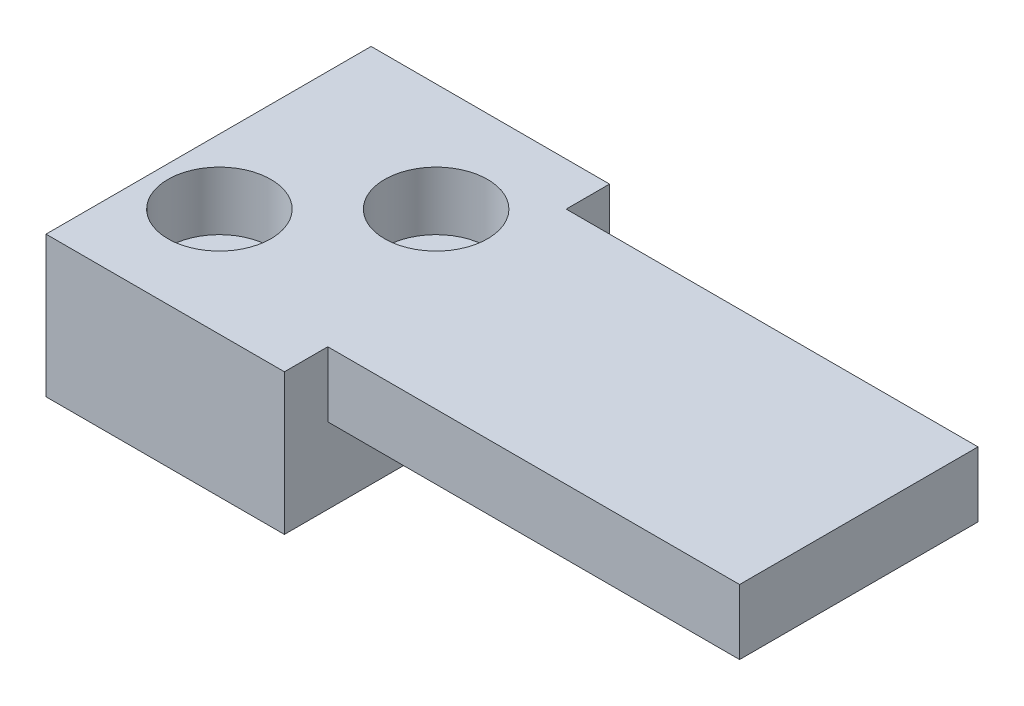
ISO-10303-21;
HEADER;
FILE_DESCRIPTION(('STEP AP214'),'2;1');
FILE_NAME('part.step','',(''),(''),'','','');
FILE_SCHEMA(('AUTOMOTIVE_DESIGN { 1 0 10303 214 1 1 1 1 }'));
ENDSEC;
DATA;
#1=APPLICATION_CONTEXT('core data for automotive mechanical design processes');
#2=APPLICATION_PROTOCOL_DEFINITION('international standard','automotive_design',2000,#1);
#3=PRODUCT_CONTEXT('',#1,'mechanical');
#4=PRODUCT('Part','Part','',(#3));
#5=PRODUCT_RELATED_PRODUCT_CATEGORY('part','',(#4));
#6=PRODUCT_DEFINITION_FORMATION('','',#4);
#7=PRODUCT_DEFINITION_CONTEXT('part definition',#1,'design');
#8=PRODUCT_DEFINITION('design','',#6,#7);
#9=PRODUCT_DEFINITION_SHAPE('','',#8);
#10=(LENGTH_UNIT() NAMED_UNIT(*) SI_UNIT(.MILLI.,.METRE.));
#11=(NAMED_UNIT(*) PLANE_ANGLE_UNIT() SI_UNIT($,.RADIAN.));
#12=(NAMED_UNIT(*) SI_UNIT($,.STERADIAN.) SOLID_ANGLE_UNIT());
#13=UNCERTAINTY_MEASURE_WITH_UNIT(LENGTH_MEASURE(1.E-05),#10,'distance_accuracy_value','');
#14=(GEOMETRIC_REPRESENTATION_CONTEXT(3) GLOBAL_UNCERTAINTY_ASSIGNED_CONTEXT((#13)) GLOBAL_UNIT_ASSIGNED_CONTEXT((#10,
#11,#12)) REPRESENTATION_CONTEXT('',''));
#15=CARTESIAN_POINT('',(0.,0.,0.));
#16=DIRECTION('',(0.,0.,1.));
#17=DIRECTION('',(1.,0.,0.));
#18=AXIS2_PLACEMENT_3D('',#15,#16,#17);
#19=CARTESIAN_POINT('',(16.,-13.,10.));
#20=DIRECTION('',(0.,1.,0.));
#21=DIRECTION('',(0.,0.,1.));
#22=AXIS2_PLACEMENT_3D('',#19,#20,#21);
#23=CYLINDRICAL_SURFACE('',#22,2.75);
#24=CARTESIAN_POINT('',(16.,-13.,10.));
#25=DIRECTION('',(0.,1.,0.));
#26=DIRECTION('',(0.,0.,1.));
#27=AXIS2_PLACEMENT_3D('',#24,#25,#26);
#28=CIRCLE('',#27,2.75);
#29=CARTESIAN_POINT('',(16.,-13.,12.75));
#30=VERTEX_POINT('',#29);
#31=EDGE_CURVE('E187',#30,#30,#28,.T.);
#32=CARTESIAN_POINT('',(16.,-5.4,10.));
#33=DIRECTION('',(0.,1.,0.));
#34=DIRECTION('',(0.,0.,1.));
#35=AXIS2_PLACEMENT_3D('',#32,#33,#34);
#36=CIRCLE('',#35,2.75);
#37=CARTESIAN_POINT('',(16.,-5.4,12.75));
#38=VERTEX_POINT('',#37);
#39=EDGE_CURVE('E65',#38,#38,#36,.F.);
#40=CARTESIAN_POINT('',(16.,-13.,12.75));
#41=CARTESIAN_POINT('',(16.,-12.9208333333333,12.75));
#42=CARTESIAN_POINT('',(16.,-12.8416666666667,12.75));
#43=CARTESIAN_POINT('',(16.,-12.6833333333333,12.75));
#44=CARTESIAN_POINT('',(16.,-12.6041666666667,12.75));
#45=CARTESIAN_POINT('',(16.,-12.4458333333333,12.75));
#46=CARTESIAN_POINT('',(16.,-12.3666666666667,12.75));
#47=CARTESIAN_POINT('',(16.,-12.2083333333333,12.75));
#48=CARTESIAN_POINT('',(16.,-12.1291666666667,12.75));
#49=CARTESIAN_POINT('',(16.,-11.9708333333333,12.75));
#50=CARTESIAN_POINT('',(16.,-11.8916666666667,12.75));
#51=CARTESIAN_POINT('',(16.,-11.7333333333333,12.75));
#52=CARTESIAN_POINT('',(16.,-11.6541666666667,12.75));
#53=CARTESIAN_POINT('',(16.,-11.4958333333333,12.75));
#54=CARTESIAN_POINT('',(16.,-11.4166666666667,12.75));
#55=CARTESIAN_POINT('',(16.,-11.2583333333333,12.75));
#56=CARTESIAN_POINT('',(16.,-11.1791666666667,12.75));
#57=CARTESIAN_POINT('',(16.,-11.0208333333333,12.75));
#58=CARTESIAN_POINT('',(16.,-10.9416666666667,12.75));
#59=CARTESIAN_POINT('',(16.,-10.7833333333333,12.75));
#60=CARTESIAN_POINT('',(16.,-10.7041666666667,12.75));
#61=CARTESIAN_POINT('',(16.,-10.5458333333333,12.75));
#62=CARTESIAN_POINT('',(16.,-10.4666666666667,12.75));
#63=CARTESIAN_POINT('',(16.,-10.3083333333333,12.75));
#64=CARTESIAN_POINT('',(16.,-10.2291666666667,12.75));
#65=CARTESIAN_POINT('',(16.,-10.0708333333333,12.75));
#66=CARTESIAN_POINT('',(16.,-9.99166666666667,12.75));
#67=CARTESIAN_POINT('',(16.,-9.83333333333333,12.75));
#68=CARTESIAN_POINT('',(16.,-9.75416666666667,12.75));
#69=CARTESIAN_POINT('',(16.,-9.59583333333333,12.75));
#70=CARTESIAN_POINT('',(16.,-9.51666666666667,12.75));
#71=CARTESIAN_POINT('',(16.,-9.35833333333333,12.75));
#72=CARTESIAN_POINT('',(16.,-9.27916666666667,12.75));
#73=CARTESIAN_POINT('',(16.,-9.12083333333334,12.75));
#74=CARTESIAN_POINT('',(16.,-9.04166666666667,12.75));
#75=CARTESIAN_POINT('',(16.,-8.88333333333333,12.75));
#76=CARTESIAN_POINT('',(16.,-8.80416666666667,12.75));
#77=CARTESIAN_POINT('',(16.,-8.64583333333334,12.75));
#78=CARTESIAN_POINT('',(16.,-8.56666666666667,12.75));
#79=CARTESIAN_POINT('',(16.,-8.40833333333333,12.75));
#80=CARTESIAN_POINT('',(16.,-8.32916666666667,12.75));
#81=CARTESIAN_POINT('',(16.,-8.17083333333334,12.75));
#82=CARTESIAN_POINT('',(16.,-8.09166666666667,12.75));
#83=CARTESIAN_POINT('',(16.,-7.93333333333334,12.75));
#84=CARTESIAN_POINT('',(16.,-7.85416666666667,12.75));
#85=CARTESIAN_POINT('',(16.,-7.69583333333334,12.75));
#86=CARTESIAN_POINT('',(16.,-7.61666666666667,12.75));
#87=CARTESIAN_POINT('',(16.,-7.45833333333334,12.75));
#88=CARTESIAN_POINT('',(16.,-7.37916666666667,12.75));
#89=CARTESIAN_POINT('',(16.,-7.22083333333334,12.75));
#90=CARTESIAN_POINT('',(16.,-7.14166666666667,12.75));
#91=CARTESIAN_POINT('',(16.,-6.98333333333334,12.75));
#92=CARTESIAN_POINT('',(16.,-6.90416666666667,12.75));
#93=CARTESIAN_POINT('',(16.,-6.74583333333334,12.75));
#94=CARTESIAN_POINT('',(16.,-6.66666666666667,12.75));
#95=CARTESIAN_POINT('',(16.,-6.50833333333334,12.75));
#96=CARTESIAN_POINT('',(16.,-6.42916666666667,12.75));
#97=CARTESIAN_POINT('',(16.,-6.27083333333334,12.75));
#98=CARTESIAN_POINT('',(16.,-6.19166666666667,12.75));
#99=CARTESIAN_POINT('',(16.,-6.03333333333334,12.75));
#100=CARTESIAN_POINT('',(16.,-5.95416666666667,12.75));
#101=CARTESIAN_POINT('',(16.,-5.79583333333334,12.75));
#102=CARTESIAN_POINT('',(16.,-5.71666666666667,12.75));
#103=CARTESIAN_POINT('',(16.,-5.55833333333334,12.75));
#104=CARTESIAN_POINT('',(16.,-5.47916666666667,12.75));
#105=CARTESIAN_POINT('',(16.,-5.4,12.75));
#106=B_SPLINE_CURVE_WITH_KNOTS('',3,(#40,#41,#42,#43,#44,#45,#46,#47,#48,#49,#50,#51,#52,#53,
#54,#55,#56,#57,#58,#59,#60,#61,#62,#63,#64,#65,#66,#67,#68,#69,#70,#71,#72,#73,#74,#75,#76,#77,
#78,#79,#80,#81,#82,#83,#84,#85,#86,#87,#88,#89,#90,#91,#92,#93,#94,#95,#96,#97,#98,#99,#100,
#101,#102,#103,#104,#105),.UNSPECIFIED.,.F.,.F.,(4,2,2,2,2,2,2,2,2,2,2,2,2,2,2,2,2,2,2,2,2,2,2,
2,2,2,2,2,2,2,2,2,4),(0.,0.2375,0.475,0.7125,0.95,1.1875,1.425,1.6625,1.9,2.1375,2.375,2.6125,
2.85,3.0875,3.325,3.5625,3.8,4.0375,4.275,4.5125,4.75,4.9875,5.225,5.4625,5.7,5.9375,6.175,
6.4125,6.65,6.8875,7.125,7.3625,7.6),.UNSPECIFIED.);
#107=EDGE_CURVE('BSEAM61',#30,#38,#106,.T.);
#108=ORIENTED_EDGE('',*,*,#31,.F.);
#109=ORIENTED_EDGE('',*,*,#39,.F.);
#110=ORIENTED_EDGE('',*,*,#107,.T.);
#111=ORIENTED_EDGE('',*,*,#107,.F.);
#112=EDGE_LOOP('',(#108,#110,#109,#111));
#113=FACE_BOUND('',#112,.T.);
#114=ADVANCED_FACE('F61',(#113),#23,.F.);
#115=CARTESIAN_POINT('',(6.,-13.,20.));
#116=DIRECTION('',(0.,1.,0.));
#117=DIRECTION('',(0.,0.,1.));
#118=AXIS2_PLACEMENT_3D('',#115,#116,#117);
#119=CYLINDRICAL_SURFACE('',#118,2.75);
#120=CARTESIAN_POINT('',(6.,-13.,20.));
#121=DIRECTION('',(0.,1.,0.));
#122=DIRECTION('',(0.,0.,1.));
#123=AXIS2_PLACEMENT_3D('',#120,#121,#122);
#124=CIRCLE('',#123,2.75);
#125=CARTESIAN_POINT('',(6.,-13.,22.75));
#126=VERTEX_POINT('',#125);
#127=EDGE_CURVE('E206',#126,#126,#124,.T.);
#128=CARTESIAN_POINT('',(6.,-5.4,20.));
#129=DIRECTION('',(0.,1.,0.));
#130=DIRECTION('',(0.,0.,1.));
#131=AXIS2_PLACEMENT_3D('',#128,#129,#130);
#132=CIRCLE('',#131,2.75);
#133=CARTESIAN_POINT('',(6.,-5.4,22.75));
#134=VERTEX_POINT('',#133);
#135=EDGE_CURVE('E177',#134,#134,#132,.F.);
#136=CARTESIAN_POINT('',(6.,-13.,22.75));
#137=CARTESIAN_POINT('',(6.,-12.9208333333333,22.75));
#138=CARTESIAN_POINT('',(6.,-12.8416666666667,22.75));
#139=CARTESIAN_POINT('',(6.,-12.6833333333333,22.75));
#140=CARTESIAN_POINT('',(6.,-12.6041666666667,22.75));
#141=CARTESIAN_POINT('',(6.,-12.4458333333333,22.75));
#142=CARTESIAN_POINT('',(6.,-12.3666666666667,22.75));
#143=CARTESIAN_POINT('',(6.,-12.2083333333333,22.75));
#144=CARTESIAN_POINT('',(6.,-12.1291666666667,22.75));
#145=CARTESIAN_POINT('',(6.,-11.9708333333333,22.75));
#146=CARTESIAN_POINT('',(6.,-11.8916666666667,22.75));
#147=CARTESIAN_POINT('',(6.,-11.7333333333333,22.75));
#148=CARTESIAN_POINT('',(6.,-11.6541666666667,22.75));
#149=CARTESIAN_POINT('',(6.,-11.4958333333333,22.75));
#150=CARTESIAN_POINT('',(6.,-11.4166666666667,22.75));
#151=CARTESIAN_POINT('',(6.,-11.2583333333333,22.75));
#152=CARTESIAN_POINT('',(6.,-11.1791666666667,22.75));
#153=CARTESIAN_POINT('',(6.,-11.0208333333333,22.75));
#154=CARTESIAN_POINT('',(6.,-10.9416666666667,22.75));
#155=CARTESIAN_POINT('',(6.,-10.7833333333333,22.75));
#156=CARTESIAN_POINT('',(6.,-10.7041666666667,22.75));
#157=CARTESIAN_POINT('',(6.,-10.5458333333333,22.75));
#158=CARTESIAN_POINT('',(6.,-10.4666666666667,22.75));
#159=CARTESIAN_POINT('',(6.,-10.3083333333333,22.75));
#160=CARTESIAN_POINT('',(6.,-10.2291666666667,22.75));
#161=CARTESIAN_POINT('',(6.,-10.0708333333333,22.75));
#162=CARTESIAN_POINT('',(6.,-9.99166666666667,22.75));
#163=CARTESIAN_POINT('',(6.,-9.83333333333333,22.75));
#164=CARTESIAN_POINT('',(6.,-9.75416666666667,22.75));
#165=CARTESIAN_POINT('',(6.,-9.59583333333333,22.75));
#166=CARTESIAN_POINT('',(6.,-9.51666666666667,22.75));
#167=CARTESIAN_POINT('',(6.,-9.35833333333333,22.75));
#168=CARTESIAN_POINT('',(6.,-9.27916666666667,22.75));
#169=CARTESIAN_POINT('',(6.,-9.12083333333334,22.75));
#170=CARTESIAN_POINT('',(6.,-9.04166666666667,22.75));
#171=CARTESIAN_POINT('',(6.,-8.88333333333333,22.75));
#172=CARTESIAN_POINT('',(6.,-8.80416666666667,22.75));
#173=CARTESIAN_POINT('',(6.,-8.64583333333334,22.75));
#174=CARTESIAN_POINT('',(6.,-8.56666666666667,22.75));
#175=CARTESIAN_POINT('',(6.,-8.40833333333333,22.75));
#176=CARTESIAN_POINT('',(6.,-8.32916666666667,22.75));
#177=CARTESIAN_POINT('',(6.,-8.17083333333334,22.75));
#178=CARTESIAN_POINT('',(6.,-8.09166666666667,22.75));
#179=CARTESIAN_POINT('',(6.,-7.93333333333334,22.75));
#180=CARTESIAN_POINT('',(6.,-7.85416666666667,22.75));
#181=CARTESIAN_POINT('',(6.,-7.69583333333334,22.75));
#182=CARTESIAN_POINT('',(6.,-7.61666666666667,22.75));
#183=CARTESIAN_POINT('',(6.,-7.45833333333334,22.75));
#184=CARTESIAN_POINT('',(6.,-7.37916666666667,22.75));
#185=CARTESIAN_POINT('',(6.,-7.22083333333334,22.75));
#186=CARTESIAN_POINT('',(6.,-7.14166666666667,22.75));
#187=CARTESIAN_POINT('',(6.,-6.98333333333334,22.75));
#188=CARTESIAN_POINT('',(6.,-6.90416666666667,22.75));
#189=CARTESIAN_POINT('',(6.,-6.74583333333334,22.75));
#190=CARTESIAN_POINT('',(6.,-6.66666666666667,22.75));
#191=CARTESIAN_POINT('',(6.,-6.50833333333334,22.75));
#192=CARTESIAN_POINT('',(6.,-6.42916666666667,22.75));
#193=CARTESIAN_POINT('',(6.,-6.27083333333334,22.75));
#194=CARTESIAN_POINT('',(6.,-6.19166666666667,22.75));
#195=CARTESIAN_POINT('',(6.,-6.03333333333334,22.75));
#196=CARTESIAN_POINT('',(6.,-5.95416666666667,22.75));
#197=CARTESIAN_POINT('',(6.,-5.79583333333334,22.75));
#198=CARTESIAN_POINT('',(6.,-5.71666666666667,22.75));
#199=CARTESIAN_POINT('',(6.,-5.55833333333334,22.75));
#200=CARTESIAN_POINT('',(6.,-5.47916666666667,22.75));
#201=CARTESIAN_POINT('',(6.,-5.4,22.75));
#202=B_SPLINE_CURVE_WITH_KNOTS('',3,(#136,#137,#138,#139,#140,#141,#142,#143,#144,#145,#146,
#147,#148,#149,#150,#151,#152,#153,#154,#155,#156,#157,#158,#159,#160,#161,#162,#163,#164,#165,
#166,#167,#168,#169,#170,#171,#172,#173,#174,#175,#176,#177,#178,#179,#180,#181,#182,#183,#184,
#185,#186,#187,#188,#189,#190,#191,#192,#193,#194,#195,#196,#197,#198,#199,#200,#201),
.UNSPECIFIED.,.F.,.F.,(4,2,2,2,2,2,2,2,2,2,2,2,2,2,2,2,2,2,2,2,2,2,2,2,2,2,2,2,2,2,2,2,4),(0.,
0.2375,0.475,0.7125,0.95,1.1875,1.425,1.6625,1.9,2.1375,2.375,2.6125,2.85,3.0875,3.325,3.5625,
3.8,4.0375,4.275,4.5125,4.75,4.9875,5.225,5.4625,5.7,5.9375,6.175,6.4125,6.65,6.8875,7.125,
7.3625,7.6),.UNSPECIFIED.);
#203=EDGE_CURVE('BSEAM281',#126,#134,#202,.T.);
#204=ORIENTED_EDGE('',*,*,#127,.F.);
#205=ORIENTED_EDGE('',*,*,#135,.F.);
#206=ORIENTED_EDGE('',*,*,#203,.T.);
#207=ORIENTED_EDGE('',*,*,#203,.F.);
#208=EDGE_LOOP('',(#204,#206,#205,#207));
#209=FACE_BOUND('',#208,.T.);
#210=ADVANCED_FACE('F281',(#209),#119,.F.);
#211=CARTESIAN_POINT('',(0.,-6.00000000000001,30.));
#212=DIRECTION('',(0.,-1.,0.));
#213=DIRECTION('',(1.,0.,0.));
#214=AXIS2_PLACEMENT_3D('',#211,#212,#213);
#215=PLANE('',#214);
#216=DIRECTION('',(0.,0.,-1.));
#217=VECTOR('',#216,1.);
#218=CARTESIAN_POINT('',(22.,-6.,30.));
#219=LINE('',#218,#217);
#220=CARTESIAN_POINT('',(22.,-6.00000000000001,26.));
#221=VERTEX_POINT('',#220);
#222=CARTESIAN_POINT('',(22.,-6.00000000000001,4.));
#223=VERTEX_POINT('',#222);
#224=EDGE_CURVE('E154',#221,#223,#219,.T.);
#225=ORIENTED_EDGE('',*,*,#224,.T.);
#226=DIRECTION('',(1.,0.,0.));
#227=VECTOR('',#226,1.);
#228=CARTESIAN_POINT('',(0.,-6.00000000000001,4.));
#229=LINE('',#228,#227);
#230=CARTESIAN_POINT('',(60.,-6.,4.));
#231=VERTEX_POINT('',#230);
#232=EDGE_CURVE('E137',#223,#231,#229,.T.);
#233=ORIENTED_EDGE('',*,*,#232,.T.);
#234=DIRECTION('',(0.,0.,-1.));
#235=VECTOR('',#234,1.);
#236=CARTESIAN_POINT('',(60.,-6.,30.));
#237=LINE('',#236,#235);
#238=CARTESIAN_POINT('',(60.,-6.,26.));
#239=VERTEX_POINT('',#238);
#240=EDGE_CURVE('E152',#239,#231,#237,.T.);
#241=ORIENTED_EDGE('',*,*,#240,.F.);
#242=DIRECTION('',(1.,0.,0.));
#243=VECTOR('',#242,1.);
#244=CARTESIAN_POINT('',(0.,-6.00000000000001,26.));
#245=LINE('',#244,#243);
#246=EDGE_CURVE('E157',#221,#239,#245,.T.);
#247=ORIENTED_EDGE('',*,*,#246,.F.);
#248=EDGE_LOOP('',(#225,#233,#241,#247));
#249=FACE_BOUND('',#248,.T.);
#250=ADVANCED_FACE('F150',(#249),#215,.T.);
#251=CARTESIAN_POINT('',(60.,0.,30.));
#252=DIRECTION('',(1.,0.,0.));
#253=DIRECTION('',(0.,0.,-1.));
#254=AXIS2_PLACEMENT_3D('',#251,#252,#253);
#255=PLANE('',#254);
#256=ORIENTED_EDGE('',*,*,#240,.T.);
#257=DIRECTION('',(0.,1.,0.));
#258=VECTOR('',#257,1.);
#259=CARTESIAN_POINT('',(60.,-13.,4.));
#260=LINE('',#259,#258);
#261=CARTESIAN_POINT('',(60.,0.,4.));
#262=VERTEX_POINT('',#261);
#263=EDGE_CURVE('E133',#231,#262,#260,.T.);
#264=ORIENTED_EDGE('',*,*,#263,.T.);
#265=DIRECTION('',(0.,0.,-1.));
#266=VECTOR('',#265,1.);
#267=CARTESIAN_POINT('',(60.,0.,30.));
#268=LINE('',#267,#266);
#269=CARTESIAN_POINT('',(60.,0.,26.));
#270=VERTEX_POINT('',#269);
#271=EDGE_CURVE('E163',#270,#262,#268,.T.);
#272=ORIENTED_EDGE('',*,*,#271,.F.);
#273=DIRECTION('',(0.,1.,0.));
#274=VECTOR('',#273,1.);
#275=CARTESIAN_POINT('',(60.,-13.,26.));
#276=LINE('',#275,#274);
#277=EDGE_CURVE('E161',#239,#270,#276,.T.);
#278=ORIENTED_EDGE('',*,*,#277,.F.);
#279=EDGE_LOOP('',(#256,#264,#272,#278));
#280=FACE_BOUND('',#279,.T.);
#281=ADVANCED_FACE('F160',(#280),#255,.T.);
#282=CARTESIAN_POINT('',(0.,0.,30.));
#283=DIRECTION('',(0.,1.,0.));
#284=DIRECTION('',(0.,0.,1.));
#285=AXIS2_PLACEMENT_3D('',#282,#283,#284);
#286=PLANE('',#285);
#287=CARTESIAN_POINT('',(6.,0.,20.));
#288=DIRECTION('',(0.,1.,0.));
#289=DIRECTION('',(0.,0.,1.));
#290=AXIS2_PLACEMENT_3D('',#287,#288,#289);
#291=CIRCLE('',#290,4.75);
#292=CARTESIAN_POINT('',(6.,0.,24.75));
#293=VERTEX_POINT('',#292);
#294=EDGE_CURVE('E189',#293,#293,#291,.T.);
#295=ORIENTED_EDGE('',*,*,#294,.F.);
#296=EDGE_LOOP('',(#295));
#297=FACE_BOUND('',#296,.T.);
#298=CARTESIAN_POINT('',(16.,0.,10.));
#299=DIRECTION('',(0.,1.,0.));
#300=DIRECTION('',(0.,0.,1.));
#301=AXIS2_PLACEMENT_3D('',#298,#299,#300);
#302=CIRCLE('',#301,4.75);
#303=CARTESIAN_POINT('',(16.,0.,14.75));
#304=VERTEX_POINT('',#303);
#305=EDGE_CURVE('E196',#304,#304,#302,.T.);
#306=ORIENTED_EDGE('',*,*,#305,.F.);
#307=EDGE_LOOP('',(#306));
#308=FACE_BOUND('',#307,.T.);
#309=DIRECTION('',(-1.,0.,0.));
#310=VECTOR('',#309,1.);
#311=CARTESIAN_POINT('',(0.,0.,4.));
#312=LINE('',#311,#310);
#313=CARTESIAN_POINT('',(22.,0.,4.));
#314=VERTEX_POINT('',#313);
#315=EDGE_CURVE('E13',#262,#314,#312,.T.);
#316=ORIENTED_EDGE('',*,*,#315,.T.);
#317=DIRECTION('',(0.,0.,-1.));
#318=VECTOR('',#317,1.);
#319=CARTESIAN_POINT('',(22.,0.,30.));
#320=LINE('',#319,#318);
#321=CARTESIAN_POINT('',(22.,0.,0.));
#322=VERTEX_POINT('',#321);
#323=EDGE_CURVE('E144',#314,#322,#320,.T.);
#324=ORIENTED_EDGE('',*,*,#323,.T.);
#325=DIRECTION('',(1.,0.,0.));
#326=VECTOR('',#325,1.);
#327=CARTESIAN_POINT('',(0.,0.,0.));
#328=LINE('',#327,#326);
#329=CARTESIAN_POINT('',(0.,0.,0.));
#330=VERTEX_POINT('',#329);
#331=EDGE_CURVE('E247',#330,#322,#328,.T.);
#332=ORIENTED_EDGE('',*,*,#331,.F.);
#333=DIRECTION('',(0.,0.,-1.));
#334=VECTOR('',#333,1.);
#335=CARTESIAN_POINT('',(0.,0.,30.));
#336=LINE('',#335,#334);
#337=CARTESIAN_POINT('',(0.,0.,30.));
#338=VERTEX_POINT('',#337);
#339=EDGE_CURVE('E170',#338,#330,#336,.T.);
#340=ORIENTED_EDGE('',*,*,#339,.F.);
#341=DIRECTION('',(1.,0.,0.));
#342=VECTOR('',#341,1.);
#343=CARTESIAN_POINT('',(0.,0.,30.));
#344=LINE('',#343,#342);
#345=CARTESIAN_POINT('',(22.,0.,30.));
#346=VERTEX_POINT('',#345);
#347=EDGE_CURVE('E234',#338,#346,#344,.T.);
#348=ORIENTED_EDGE('',*,*,#347,.T.);
#349=DIRECTION('',(0.,0.,1.));
#350=VECTOR('',#349,1.);
#351=CARTESIAN_POINT('',(22.,0.,30.));
#352=LINE('',#351,#350);
#353=CARTESIAN_POINT('',(22.,0.,26.));
#354=VERTEX_POINT('',#353);
#355=EDGE_CURVE('E224',#354,#346,#352,.T.);
#356=ORIENTED_EDGE('',*,*,#355,.F.);
#357=DIRECTION('',(-1.,0.,0.));
#358=VECTOR('',#357,1.);
#359=CARTESIAN_POINT('',(0.,0.,26.));
#360=LINE('',#359,#358);
#361=EDGE_CURVE('E71',#270,#354,#360,.T.);
#362=ORIENTED_EDGE('',*,*,#361,.F.);
#363=ORIENTED_EDGE('',*,*,#271,.T.);
#364=EDGE_LOOP('',(#316,#324,#332,#340,#348,#356,#362,#363));
#365=FACE_BOUND('',#364,.T.);
#366=ADVANCED_FACE('F263',(#297,#308,#365),#286,.T.);
#367=CARTESIAN_POINT('',(0.,0.,0.));
#368=DIRECTION('',(0.,0.,1.));
#369=DIRECTION('',(1.,0.,0.));
#370=AXIS2_PLACEMENT_3D('',#367,#368,#369);
#371=PLANE('',#370);
#372=ORIENTED_EDGE('',*,*,#331,.T.);
#373=DIRECTION('',(0.,1.,0.));
#374=VECTOR('',#373,1.);
#375=CARTESIAN_POINT('',(22.,0.,0.));
#376=LINE('',#375,#374);
#377=CARTESIAN_POINT('',(22.,-13.,0.));
#378=VERTEX_POINT('',#377);
#379=EDGE_CURVE('E244',#378,#322,#376,.T.);
#380=ORIENTED_EDGE('',*,*,#379,.F.);
#381=DIRECTION('',(1.,0.,0.));
#382=VECTOR('',#381,1.);
#383=CARTESIAN_POINT('',(0.,-13.,0.));
#384=LINE('',#383,#382);
#385=CARTESIAN_POINT('',(0.,-13.,0.));
#386=VERTEX_POINT('',#385);
#387=EDGE_CURVE('E156',#386,#378,#384,.T.);
#388=ORIENTED_EDGE('',*,*,#387,.F.);
#389=DIRECTION('',(0.,-1.,0.));
#390=VECTOR('',#389,1.);
#391=CARTESIAN_POINT('',(0.,0.,0.));
#392=LINE('',#391,#390);
#393=EDGE_CURVE('E102',#330,#386,#392,.T.);
#394=ORIENTED_EDGE('',*,*,#393,.F.);
#395=EDGE_LOOP('',(#372,#380,#388,#394));
#396=FACE_BOUND('',#395,.T.);
#397=ADVANCED_FACE('F261',(#396),#371,.F.);
#398=CARTESIAN_POINT('',(0.,-13.,30.));
#399=DIRECTION('',(0.,1.,0.));
#400=DIRECTION('',(0.,0.,1.));
#401=AXIS2_PLACEMENT_3D('',#398,#399,#400);
#402=PLANE('',#401);
#403=ORIENTED_EDGE('',*,*,#127,.T.);
#404=EDGE_LOOP('',(#403));
#405=FACE_BOUND('',#404,.T.);
#406=ORIENTED_EDGE('',*,*,#31,.T.);
#407=EDGE_LOOP('',(#406));
#408=FACE_BOUND('',#407,.T.);
#409=ORIENTED_EDGE('',*,*,#387,.T.);
#410=DIRECTION('',(0.,0.,-1.));
#411=VECTOR('',#410,1.);
#412=CARTESIAN_POINT('',(22.,-13.,30.));
#413=LINE('',#412,#411);
#414=CARTESIAN_POINT('',(22.,-13.,30.));
#415=VERTEX_POINT('',#414);
#416=EDGE_CURVE('E168',#415,#378,#413,.T.);
#417=ORIENTED_EDGE('',*,*,#416,.F.);
#418=DIRECTION('',(1.,0.,0.));
#419=VECTOR('',#418,1.);
#420=CARTESIAN_POINT('',(0.,-13.,30.));
#421=LINE('',#420,#419);
#422=CARTESIAN_POINT('',(0.,-13.,30.));
#423=VERTEX_POINT('',#422);
#424=EDGE_CURVE('E229',#423,#415,#421,.T.);
#425=ORIENTED_EDGE('',*,*,#424,.F.);
#426=DIRECTION('',(0.,0.,-1.));
#427=VECTOR('',#426,1.);
#428=CARTESIAN_POINT('',(0.,-13.,30.));
#429=LINE('',#428,#427);
#430=EDGE_CURVE('E240',#423,#386,#429,.T.);
#431=ORIENTED_EDGE('',*,*,#430,.T.);
#432=EDGE_LOOP('',(#409,#417,#425,#431));
#433=FACE_BOUND('',#432,.T.);
#434=ADVANCED_FACE('F63',(#405,#408,#433),#402,.F.);
#435=CARTESIAN_POINT('',(22.,0.,30.));
#436=DIRECTION('',(-1.,0.,0.));
#437=DIRECTION('',(0.,0.,1.));
#438=AXIS2_PLACEMENT_3D('',#435,#436,#437);
#439=PLANE('',#438);
#440=ORIENTED_EDGE('',*,*,#379,.T.);
#441=ORIENTED_EDGE('',*,*,#323,.F.);
#442=DIRECTION('',(0.,1.,0.));
#443=VECTOR('',#442,1.);
#444=CARTESIAN_POINT('',(22.,-13.,4.));
#445=LINE('',#444,#443);
#446=EDGE_CURVE('E145',#223,#314,#445,.T.);
#447=ORIENTED_EDGE('',*,*,#446,.F.);
#448=ORIENTED_EDGE('',*,*,#224,.F.);
#449=DIRECTION('',(0.,1.,0.));
#450=VECTOR('',#449,1.);
#451=CARTESIAN_POINT('',(22.,-13.,26.));
#452=LINE('',#451,#450);
#453=EDGE_CURVE('E210',#221,#354,#452,.T.);
#454=ORIENTED_EDGE('',*,*,#453,.T.);
#455=ORIENTED_EDGE('',*,*,#355,.T.);
#456=DIRECTION('',(0.,1.,0.));
#457=VECTOR('',#456,1.);
#458=CARTESIAN_POINT('',(22.,0.,30.));
#459=LINE('',#458,#457);
#460=EDGE_CURVE('E79',#415,#346,#459,.T.);
#461=ORIENTED_EDGE('',*,*,#460,.F.);
#462=ORIENTED_EDGE('',*,*,#416,.T.);
#463=EDGE_LOOP('',(#440,#441,#447,#448,#454,#455,#461,#462));
#464=FACE_BOUND('',#463,.T.);
#465=ADVANCED_FACE('F264',(#464),#439,.F.);
#466=CARTESIAN_POINT('',(0.,0.,30.));
#467=DIRECTION('',(1.,0.,0.));
#468=DIRECTION('',(0.,1.,0.));
#469=AXIS2_PLACEMENT_3D('',#466,#467,#468);
#470=PLANE('',#469);
#471=ORIENTED_EDGE('',*,*,#393,.T.);
#472=ORIENTED_EDGE('',*,*,#430,.F.);
#473=DIRECTION('',(0.,-1.,0.));
#474=VECTOR('',#473,1.);
#475=CARTESIAN_POINT('',(0.,0.,30.));
#476=LINE('',#475,#474);
#477=EDGE_CURVE('E85',#338,#423,#476,.T.);
#478=ORIENTED_EDGE('',*,*,#477,.F.);
#479=ORIENTED_EDGE('',*,*,#339,.T.);
#480=EDGE_LOOP('',(#471,#472,#478,#479));
#481=FACE_BOUND('',#480,.T.);
#482=ADVANCED_FACE('F256',(#481),#470,.F.);
#483=CARTESIAN_POINT('',(0.,0.,30.));
#484=DIRECTION('',(0.,0.,1.));
#485=DIRECTION('',(1.,0.,0.));
#486=AXIS2_PLACEMENT_3D('',#483,#484,#485);
#487=PLANE('',#486);
#488=ORIENTED_EDGE('',*,*,#460,.T.);
#489=ORIENTED_EDGE('',*,*,#347,.F.);
#490=ORIENTED_EDGE('',*,*,#477,.T.);
#491=ORIENTED_EDGE('',*,*,#424,.T.);
#492=EDGE_LOOP('',(#488,#489,#490,#491));
#493=FACE_BOUND('',#492,.T.);
#494=ADVANCED_FACE('F268',(#493),#487,.T.);
#495=CARTESIAN_POINT('',(0.,-13.,4.));
#496=DIRECTION('',(0.,0.,-1.));
#497=DIRECTION('',(-1.,0.,0.));
#498=AXIS2_PLACEMENT_3D('',#495,#496,#497);
#499=PLANE('',#498);
#500=ORIENTED_EDGE('',*,*,#446,.T.);
#501=ORIENTED_EDGE('',*,*,#315,.F.);
#502=ORIENTED_EDGE('',*,*,#263,.F.);
#503=ORIENTED_EDGE('',*,*,#232,.F.);
#504=EDGE_LOOP('',(#500,#501,#502,#503));
#505=FACE_BOUND('',#504,.T.);
#506=ADVANCED_FACE('F136',(#505),#499,.T.);
#507=CARTESIAN_POINT('',(0.,-13.,26.));
#508=DIRECTION('',(0.,0.,-1.));
#509=DIRECTION('',(-1.,0.,0.));
#510=AXIS2_PLACEMENT_3D('',#507,#508,#509);
#511=PLANE('',#510);
#512=ORIENTED_EDGE('',*,*,#246,.T.);
#513=ORIENTED_EDGE('',*,*,#277,.T.);
#514=ORIENTED_EDGE('',*,*,#361,.T.);
#515=ORIENTED_EDGE('',*,*,#453,.F.);
#516=EDGE_LOOP('',(#512,#513,#514,#515));
#517=FACE_BOUND('',#516,.T.);
#518=ADVANCED_FACE('F275',(#517),#511,.F.);
#519=CARTESIAN_POINT('',(6.,-5.4,20.));
#520=DIRECTION('',(0.,1.,0.));
#521=DIRECTION('',(0.,0.,1.));
#522=AXIS2_PLACEMENT_3D('',#519,#520,#521);
#523=PLANE('',#522);
#524=CARTESIAN_POINT('',(6.,-5.4,20.));
#525=DIRECTION('',(0.,1.,0.));
#526=DIRECTION('',(0.,0.,1.));
#527=AXIS2_PLACEMENT_3D('',#524,#525,#526);
#528=CIRCLE('',#527,4.75);
#529=CARTESIAN_POINT('',(6.,-5.4,24.75));
#530=VERTEX_POINT('',#529);
#531=EDGE_CURVE('E180',#530,#530,#528,.T.);
#532=ORIENTED_EDGE('',*,*,#531,.T.);
#533=EDGE_LOOP('',(#532));
#534=FACE_BOUND('',#533,.T.);
#535=ORIENTED_EDGE('',*,*,#135,.T.);
#536=EDGE_LOOP('',(#535));
#537=FACE_BOUND('',#536,.T.);
#538=ADVANCED_FACE('F293',(#534,#537),#523,.T.);
#539=CARTESIAN_POINT('',(6.,-5.4,20.));
#540=DIRECTION('',(0.,1.,0.));
#541=DIRECTION('',(0.,0.,1.));
#542=AXIS2_PLACEMENT_3D('',#539,#540,#541);
#543=CYLINDRICAL_SURFACE('',#542,4.75);
#544=CARTESIAN_POINT('',(6.,-5.4,24.75));
#545=CARTESIAN_POINT('',(6.,-5.34375,24.75));
#546=CARTESIAN_POINT('',(6.,-5.2875,24.75));
#547=CARTESIAN_POINT('',(6.,-5.175,24.75));
#548=CARTESIAN_POINT('',(6.,-5.11875,24.75));
#549=CARTESIAN_POINT('',(6.,-5.00625,24.75));
#550=CARTESIAN_POINT('',(6.,-4.95,24.75));
#551=CARTESIAN_POINT('',(6.,-4.8375,24.75));
#552=CARTESIAN_POINT('',(6.,-4.78125,24.75));
#553=CARTESIAN_POINT('',(6.,-4.66875,24.75));
#554=CARTESIAN_POINT('',(6.,-4.6125,24.75));
#555=CARTESIAN_POINT('',(6.,-4.5,24.75));
#556=CARTESIAN_POINT('',(6.,-4.44375,24.75));
#557=CARTESIAN_POINT('',(6.,-4.33125,24.75));
#558=CARTESIAN_POINT('',(6.,-4.275,24.75));
#559=CARTESIAN_POINT('',(6.,-4.1625,24.75));
#560=CARTESIAN_POINT('',(6.,-4.10625,24.75));
#561=CARTESIAN_POINT('',(6.,-3.99375,24.75));
#562=CARTESIAN_POINT('',(6.,-3.9375,24.75));
#563=CARTESIAN_POINT('',(6.,-3.825,24.75));
#564=CARTESIAN_POINT('',(6.,-3.76875,24.75));
#565=CARTESIAN_POINT('',(6.,-3.65625,24.75));
#566=CARTESIAN_POINT('',(6.,-3.6,24.75));
#567=CARTESIAN_POINT('',(6.,-3.4875,24.75));
#568=CARTESIAN_POINT('',(6.,-3.43125,24.75));
#569=CARTESIAN_POINT('',(6.,-3.31875,24.75));
#570=CARTESIAN_POINT('',(6.,-3.2625,24.75));
#571=CARTESIAN_POINT('',(6.,-3.15,24.75));
#572=CARTESIAN_POINT('',(6.,-3.09375,24.75));
#573=CARTESIAN_POINT('',(6.,-2.98125,24.75));
#574=CARTESIAN_POINT('',(6.,-2.925,24.75));
#575=CARTESIAN_POINT('',(6.,-2.8125,24.75));
#576=CARTESIAN_POINT('',(6.,-2.75625,24.75));
#577=CARTESIAN_POINT('',(6.,-2.64375,24.75));
#578=CARTESIAN_POINT('',(6.,-2.5875,24.75));
#579=CARTESIAN_POINT('',(6.,-2.475,24.75));
#580=CARTESIAN_POINT('',(6.,-2.41875,24.75));
#581=CARTESIAN_POINT('',(6.,-2.30625,24.75));
#582=CARTESIAN_POINT('',(6.,-2.25,24.75));
#583=CARTESIAN_POINT('',(6.,-2.1375,24.75));
#584=CARTESIAN_POINT('',(6.,-2.08125,24.75));
#585=CARTESIAN_POINT('',(6.,-1.96875,24.75));
#586=CARTESIAN_POINT('',(6.,-1.9125,24.75));
#587=CARTESIAN_POINT('',(6.,-1.8,24.75));
#588=CARTESIAN_POINT('',(6.,-1.74375,24.75));
#589=CARTESIAN_POINT('',(6.,-1.63125,24.75));
#590=CARTESIAN_POINT('',(6.,-1.575,24.75));
#591=CARTESIAN_POINT('',(6.,-1.4625,24.75));
#592=CARTESIAN_POINT('',(6.,-1.40625,24.75));
#593=CARTESIAN_POINT('',(6.,-1.29375,24.75));
#594=CARTESIAN_POINT('',(6.,-1.2375,24.75));
#595=CARTESIAN_POINT('',(6.,-1.125,24.75));
#596=CARTESIAN_POINT('',(6.,-1.06875,24.75));
#597=CARTESIAN_POINT('',(6.,-0.956250000000001,24.75));
#598=CARTESIAN_POINT('',(6.,-0.900000000000001,24.75));
#599=CARTESIAN_POINT('',(6.,-0.787500000000001,24.75));
#600=CARTESIAN_POINT('',(6.,-0.731250000000001,24.75));
#601=CARTESIAN_POINT('',(6.,-0.618750000000001,24.75));
#602=CARTESIAN_POINT('',(6.,-0.562500000000001,24.75));
#603=CARTESIAN_POINT('',(6.,-0.450000000000001,24.75));
#604=CARTESIAN_POINT('',(6.,-0.393750000000001,24.75));
#605=CARTESIAN_POINT('',(6.,-0.281250000000001,24.75));
#606=CARTESIAN_POINT('',(6.,-0.225000000000001,24.75));
#607=CARTESIAN_POINT('',(6.,-0.112500000000001,24.75));
#608=CARTESIAN_POINT('',(6.,-0.0562500000000009,24.75));
#609=CARTESIAN_POINT('',(6.,0.,24.75));
#610=B_SPLINE_CURVE_WITH_KNOTS('',3,(#544,#545,#546,#547,#548,#549,#550,#551,#552,#553,#554,
#555,#556,#557,#558,#559,#560,#561,#562,#563,#564,#565,#566,#567,#568,#569,#570,#571,#572,#573,
#574,#575,#576,#577,#578,#579,#580,#581,#582,#583,#584,#585,#586,#587,#588,#589,#590,#591,#592,
#593,#594,#595,#596,#597,#598,#599,#600,#601,#602,#603,#604,#605,#606,#607,#608,#609),
.UNSPECIFIED.,.F.,.F.,(4,2,2,2,2,2,2,2,2,2,2,2,2,2,2,2,2,2,2,2,2,2,2,2,2,2,2,2,2,2,2,2,4),(0.,
0.168750000000001,0.3375,0.506250000000001,0.675000000000001,0.843750000000001,1.0125,1.18125,
1.35,1.51875,1.6875,1.85625,2.025,2.19375,2.3625,2.53125,2.7,2.86875,3.0375,3.20625,3.375,
3.54375,3.7125,3.88125,4.05,4.21875,4.3875,4.55625,4.725,4.89375,5.0625,5.23125,5.4),.UNSPECIFIED.);
#611=EDGE_CURVE('BSEAM298',#530,#293,#610,.T.);
#612=ORIENTED_EDGE('',*,*,#531,.F.);
#613=ORIENTED_EDGE('',*,*,#294,.T.);
#614=ORIENTED_EDGE('',*,*,#611,.T.);
#615=ORIENTED_EDGE('',*,*,#611,.F.);
#616=EDGE_LOOP('',(#612,#614,#613,#615));
#617=FACE_BOUND('',#616,.T.);
#618=ADVANCED_FACE('F298',(#617),#543,.F.);
#619=CARTESIAN_POINT('',(16.,-5.4,10.));
#620=DIRECTION('',(0.,1.,0.));
#621=DIRECTION('',(0.,0.,1.));
#622=AXIS2_PLACEMENT_3D('',#619,#620,#621);
#623=PLANE('',#622);
#624=CARTESIAN_POINT('',(16.,-5.4,10.));
#625=DIRECTION('',(0.,1.,0.));
#626=DIRECTION('',(0.,0.,1.));
#627=AXIS2_PLACEMENT_3D('',#624,#625,#626);
#628=CIRCLE('',#627,4.75);
#629=CARTESIAN_POINT('',(16.,-5.4,14.75));
#630=VERTEX_POINT('',#629);
#631=EDGE_CURVE('E202',#630,#630,#628,.T.);
#632=ORIENTED_EDGE('',*,*,#631,.T.);
#633=EDGE_LOOP('',(#632));
#634=FACE_BOUND('',#633,.T.);
#635=ORIENTED_EDGE('',*,*,#39,.T.);
#636=EDGE_LOOP('',(#635));
#637=FACE_BOUND('',#636,.T.);
#638=ADVANCED_FACE('F305',(#634,#637),#623,.T.);
#639=CARTESIAN_POINT('',(16.,-5.4,10.));
#640=DIRECTION('',(0.,1.,0.));
#641=DIRECTION('',(0.,0.,1.));
#642=AXIS2_PLACEMENT_3D('',#639,#640,#641);
#643=CYLINDRICAL_SURFACE('',#642,4.75);
#644=CARTESIAN_POINT('',(16.,-5.4,14.75));
#645=CARTESIAN_POINT('',(16.,-5.34375,14.75));
#646=CARTESIAN_POINT('',(16.,-5.2875,14.75));
#647=CARTESIAN_POINT('',(16.,-5.175,14.75));
#648=CARTESIAN_POINT('',(16.,-5.11875,14.75));
#649=CARTESIAN_POINT('',(16.,-5.00625,14.75));
#650=CARTESIAN_POINT('',(16.,-4.95,14.75));
#651=CARTESIAN_POINT('',(16.,-4.8375,14.75));
#652=CARTESIAN_POINT('',(16.,-4.78125,14.75));
#653=CARTESIAN_POINT('',(16.,-4.66875,14.75));
#654=CARTESIAN_POINT('',(16.,-4.6125,14.75));
#655=CARTESIAN_POINT('',(16.,-4.5,14.75));
#656=CARTESIAN_POINT('',(16.,-4.44375,14.75));
#657=CARTESIAN_POINT('',(16.,-4.33125,14.75));
#658=CARTESIAN_POINT('',(16.,-4.275,14.75));
#659=CARTESIAN_POINT('',(16.,-4.1625,14.75));
#660=CARTESIAN_POINT('',(16.,-4.10625,14.75));
#661=CARTESIAN_POINT('',(16.,-3.99375,14.75));
#662=CARTESIAN_POINT('',(16.,-3.9375,14.75));
#663=CARTESIAN_POINT('',(16.,-3.825,14.75));
#664=CARTESIAN_POINT('',(16.,-3.76875,14.75));
#665=CARTESIAN_POINT('',(16.,-3.65625,14.75));
#666=CARTESIAN_POINT('',(16.,-3.6,14.75));
#667=CARTESIAN_POINT('',(16.,-3.4875,14.75));
#668=CARTESIAN_POINT('',(16.,-3.43125,14.75));
#669=CARTESIAN_POINT('',(16.,-3.31875,14.75));
#670=CARTESIAN_POINT('',(16.,-3.2625,14.75));
#671=CARTESIAN_POINT('',(16.,-3.15,14.75));
#672=CARTESIAN_POINT('',(16.,-3.09375,14.75));
#673=CARTESIAN_POINT('',(16.,-2.98125,14.75));
#674=CARTESIAN_POINT('',(16.,-2.925,14.75));
#675=CARTESIAN_POINT('',(16.,-2.8125,14.75));
#676=CARTESIAN_POINT('',(16.,-2.75625,14.75));
#677=CARTESIAN_POINT('',(16.,-2.64375,14.75));
#678=CARTESIAN_POINT('',(16.,-2.5875,14.75));
#679=CARTESIAN_POINT('',(16.,-2.475,14.75));
#680=CARTESIAN_POINT('',(16.,-2.41875,14.75));
#681=CARTESIAN_POINT('',(16.,-2.30625,14.75));
#682=CARTESIAN_POINT('',(16.,-2.25,14.75));
#683=CARTESIAN_POINT('',(16.,-2.1375,14.75));
#684=CARTESIAN_POINT('',(16.,-2.08125,14.75));
#685=CARTESIAN_POINT('',(16.,-1.96875,14.75));
#686=CARTESIAN_POINT('',(16.,-1.9125,14.75));
#687=CARTESIAN_POINT('',(16.,-1.8,14.75));
#688=CARTESIAN_POINT('',(16.,-1.74375,14.75));
#689=CARTESIAN_POINT('',(16.,-1.63125,14.75));
#690=CARTESIAN_POINT('',(16.,-1.575,14.75));
#691=CARTESIAN_POINT('',(16.,-1.4625,14.75));
#692=CARTESIAN_POINT('',(16.,-1.40625,14.75));
#693=CARTESIAN_POINT('',(16.,-1.29375,14.75));
#694=CARTESIAN_POINT('',(16.,-1.2375,14.75));
#695=CARTESIAN_POINT('',(16.,-1.125,14.75));
#696=CARTESIAN_POINT('',(16.,-1.06875,14.75));
#697=CARTESIAN_POINT('',(16.,-0.956250000000001,14.75));
#698=CARTESIAN_POINT('',(16.,-0.900000000000001,14.75));
#699=CARTESIAN_POINT('',(16.,-0.787500000000001,14.75));
#700=CARTESIAN_POINT('',(16.,-0.731250000000001,14.75));
#701=CARTESIAN_POINT('',(16.,-0.618750000000001,14.75));
#702=CARTESIAN_POINT('',(16.,-0.562500000000001,14.75));
#703=CARTESIAN_POINT('',(16.,-0.450000000000001,14.75));
#704=CARTESIAN_POINT('',(16.,-0.393750000000001,14.75));
#705=CARTESIAN_POINT('',(16.,-0.281250000000001,14.75));
#706=CARTESIAN_POINT('',(16.,-0.225000000000001,14.75));
#707=CARTESIAN_POINT('',(16.,-0.112500000000001,14.75));
#708=CARTESIAN_POINT('',(16.,-0.0562500000000009,14.75));
#709=CARTESIAN_POINT('',(16.,0.,14.75));
#710=B_SPLINE_CURVE_WITH_KNOTS('',3,(#644,#645,#646,#647,#648,#649,#650,#651,#652,#653,#654,
#655,#656,#657,#658,#659,#660,#661,#662,#663,#664,#665,#666,#667,#668,#669,#670,#671,#672,#673,
#674,#675,#676,#677,#678,#679,#680,#681,#682,#683,#684,#685,#686,#687,#688,#689,#690,#691,#692,
#693,#694,#695,#696,#697,#698,#699,#700,#701,#702,#703,#704,#705,#706,#707,#708,#709),
.UNSPECIFIED.,.F.,.F.,(4,2,2,2,2,2,2,2,2,2,2,2,2,2,2,2,2,2,2,2,2,2,2,2,2,2,2,2,2,2,2,2,4),(0.,
0.168750000000001,0.3375,0.506250000000001,0.675000000000001,0.843750000000001,1.0125,1.18125,
1.35,1.51875,1.6875,1.85625,2.025,2.19375,2.3625,2.53125,2.7,2.86875,3.0375,3.20625,3.375,
3.54375,3.7125,3.88125,4.05,4.21875,4.3875,4.55625,4.725,4.89375,5.0625,5.23125,5.4),.UNSPECIFIED.);
#711=EDGE_CURVE('BSEAM309',#630,#304,#710,.T.);
#712=ORIENTED_EDGE('',*,*,#631,.F.);
#713=ORIENTED_EDGE('',*,*,#305,.T.);
#714=ORIENTED_EDGE('',*,*,#711,.T.);
#715=ORIENTED_EDGE('',*,*,#711,.F.);
#716=EDGE_LOOP('',(#712,#714,#713,#715));
#717=FACE_BOUND('',#716,.T.);
#718=ADVANCED_FACE('F309',(#717),#643,.F.);
#719=CLOSED_SHELL('',(#114,#210,#250,#281,#366,#397,#434,#465,#482,#494,#506,#518,#538,#618,
#638,#718));
#720=MANIFOLD_SOLID_BREP('B2',#719);
#721=ADVANCED_BREP_SHAPE_REPRESENTATION('',(#18,#720),#14);
#722=SHAPE_DEFINITION_REPRESENTATION(#9,#721);
ENDSEC;
END-ISO-10303-21;
